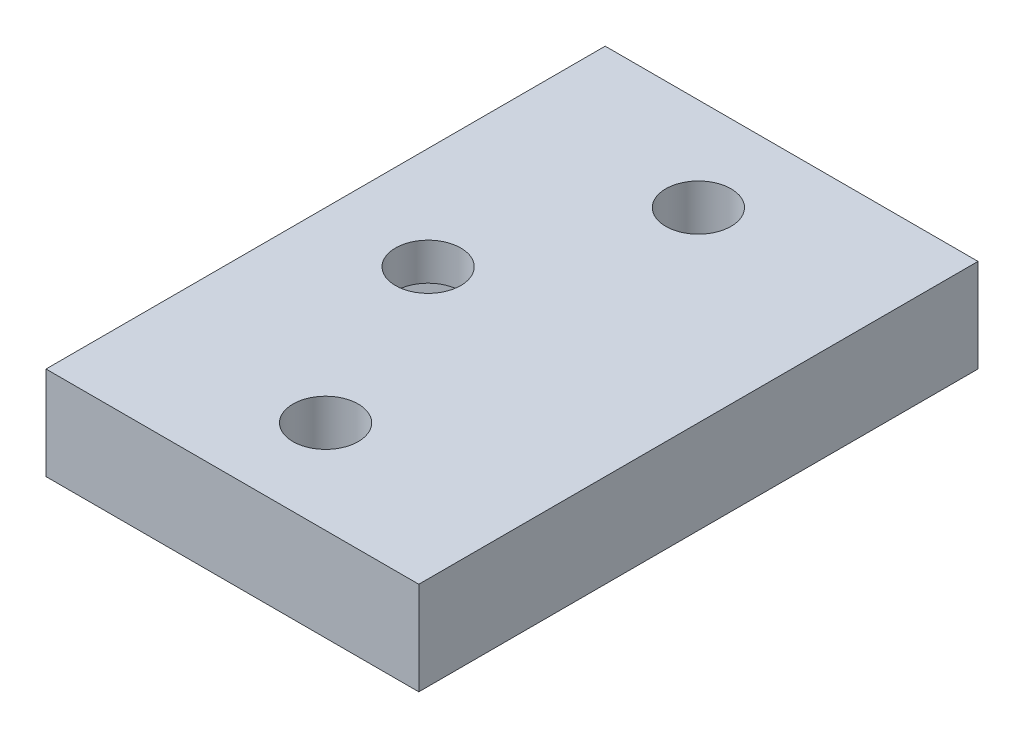
ISO-10303-21;
HEADER;
FILE_DESCRIPTION(('STEP AP214'),'2;1');
FILE_NAME('part.step','',(''),(''),'','','');
FILE_SCHEMA(('AUTOMOTIVE_DESIGN { 1 0 10303 214 1 1 1 1 }'));
ENDSEC;
DATA;
#1=APPLICATION_CONTEXT('core data for automotive mechanical design processes');
#2=APPLICATION_PROTOCOL_DEFINITION('international standard','automotive_design',2000,#1);
#3=PRODUCT_CONTEXT('',#1,'mechanical');
#4=PRODUCT('Part','Part','',(#3));
#5=PRODUCT_RELATED_PRODUCT_CATEGORY('part','',(#4));
#6=PRODUCT_DEFINITION_FORMATION('','',#4);
#7=PRODUCT_DEFINITION_CONTEXT('part definition',#1,'design');
#8=PRODUCT_DEFINITION('design','',#6,#7);
#9=PRODUCT_DEFINITION_SHAPE('','',#8);
#10=(LENGTH_UNIT() NAMED_UNIT(*) SI_UNIT(.MILLI.,.METRE.));
#11=(NAMED_UNIT(*) PLANE_ANGLE_UNIT() SI_UNIT($,.RADIAN.));
#12=(NAMED_UNIT(*) SI_UNIT($,.STERADIAN.) SOLID_ANGLE_UNIT());
#13=UNCERTAINTY_MEASURE_WITH_UNIT(LENGTH_MEASURE(1.E-05),#10,'distance_accuracy_value','');
#14=(GEOMETRIC_REPRESENTATION_CONTEXT(3) GLOBAL_UNCERTAINTY_ASSIGNED_CONTEXT((#13)) GLOBAL_UNIT_ASSIGNED_CONTEXT((#10,
#11,#12)) REPRESENTATION_CONTEXT('',''));
#15=CARTESIAN_POINT('',(0.,0.,0.));
#16=DIRECTION('',(0.,0.,1.));
#17=DIRECTION('',(1.,0.,0.));
#18=AXIS2_PLACEMENT_3D('',#15,#16,#17);
#19=CARTESIAN_POINT('',(0.,5.,0.));
#20=DIRECTION('',(1.,0.,0.));
#21=DIRECTION('',(0.,0.,-1.));
#22=AXIS2_PLACEMENT_3D('',#19,#20,#21);
#23=PLANE('',#22);
#24=DIRECTION('',(0.,0.,1.));
#25=VECTOR('',#24,1.);
#26=CARTESIAN_POINT('',(0.,0.,0.));
#27=LINE('',#26,#25);
#28=CARTESIAN_POINT('',(0.,0.,-30.));
#29=VERTEX_POINT('',#28);
#30=CARTESIAN_POINT('',(0.,0.,-18.));
#31=VERTEX_POINT('',#30);
#32=EDGE_CURVE('E157',#29,#31,#27,.T.);
#33=ORIENTED_EDGE('',*,*,#32,.T.);
#34=DIRECTION('',(0.,-1.,0.));
#35=VECTOR('',#34,1.);
#36=CARTESIAN_POINT('',(0.,0.,-18.));
#37=LINE('',#36,#35);
#38=CARTESIAN_POINT('',(0.,3.,-18.));
#39=VERTEX_POINT('',#38);
#40=EDGE_CURVE('E178',#39,#31,#37,.T.);
#41=ORIENTED_EDGE('',*,*,#40,.F.);
#42=DIRECTION('',(0.,0.,-1.));
#43=VECTOR('',#42,1.);
#44=CARTESIAN_POINT('',(0.,3.,-18.));
#45=LINE('',#44,#43);
#46=CARTESIAN_POINT('',(0.,3.,-12.));
#47=VERTEX_POINT('',#46);
#48=EDGE_CURVE('E202',#47,#39,#45,.T.);
#49=ORIENTED_EDGE('',*,*,#48,.F.);
#50=DIRECTION('',(0.,1.,0.));
#51=VECTOR('',#50,1.);
#52=CARTESIAN_POINT('',(0.,0.,-12.));
#53=LINE('',#52,#51);
#54=CARTESIAN_POINT('',(0.,0.,-12.));
#55=VERTEX_POINT('',#54);
#56=EDGE_CURVE('E200',#55,#47,#53,.T.);
#57=ORIENTED_EDGE('',*,*,#56,.F.);
#58=CARTESIAN_POINT('',(0.,0.,0.));
#59=VERTEX_POINT('',#58);
#60=EDGE_CURVE('E127',#55,#59,#27,.T.);
#61=ORIENTED_EDGE('',*,*,#60,.T.);
#62=DIRECTION('',(0.,-1.,0.));
#63=VECTOR('',#62,1.);
#64=CARTESIAN_POINT('',(0.,5.,0.));
#65=LINE('',#64,#63);
#66=CARTESIAN_POINT('',(0.,5.,0.));
#67=VERTEX_POINT('',#66);
#68=EDGE_CURVE('E11',#67,#59,#65,.T.);
#69=ORIENTED_EDGE('',*,*,#68,.F.);
#70=DIRECTION('',(0.,0.,1.));
#71=VECTOR('',#70,1.);
#72=CARTESIAN_POINT('',(0.,5.,0.));
#73=LINE('',#72,#71);
#74=CARTESIAN_POINT('',(0.,5.,-30.));
#75=VERTEX_POINT('',#74);
#76=EDGE_CURVE('E150',#75,#67,#73,.T.);
#77=ORIENTED_EDGE('',*,*,#76,.F.);
#78=DIRECTION('',(0.,-1.,0.));
#79=VECTOR('',#78,1.);
#80=CARTESIAN_POINT('',(0.,5.,-30.));
#81=LINE('',#80,#79);
#82=EDGE_CURVE('E156',#75,#29,#81,.T.);
#83=ORIENTED_EDGE('',*,*,#82,.T.);
#84=EDGE_LOOP('',(#33,#41,#49,#57,#61,#69,#77,#83));
#85=FACE_BOUND('',#84,.T.);
#86=ADVANCED_FACE('F32',(#85),#23,.F.);
#87=CARTESIAN_POINT('',(0.,5.,0.));
#88=DIRECTION('',(0.,0.,-1.));
#89=DIRECTION('',(-1.,0.,0.));
#90=AXIS2_PLACEMENT_3D('',#87,#88,#89);
#91=PLANE('',#90);
#92=DIRECTION('',(1.,0.,0.));
#93=VECTOR('',#92,1.);
#94=CARTESIAN_POINT('',(0.,0.,0.));
#95=LINE('',#94,#93);
#96=CARTESIAN_POINT('',(20.,0.,0.));
#97=VERTEX_POINT('',#96);
#98=EDGE_CURVE('E160',#59,#97,#95,.T.);
#99=ORIENTED_EDGE('',*,*,#98,.T.);
#100=DIRECTION('',(0.,-1.,0.));
#101=VECTOR('',#100,1.);
#102=CARTESIAN_POINT('',(20.,5.,0.));
#103=LINE('',#102,#101);
#104=CARTESIAN_POINT('',(20.,5.,0.));
#105=VERTEX_POINT('',#104);
#106=EDGE_CURVE('E40',#105,#97,#103,.T.);
#107=ORIENTED_EDGE('',*,*,#106,.F.);
#108=DIRECTION('',(1.,0.,0.));
#109=VECTOR('',#108,1.);
#110=CARTESIAN_POINT('',(0.,5.,0.));
#111=LINE('',#110,#109);
#112=EDGE_CURVE('E84',#67,#105,#111,.T.);
#113=ORIENTED_EDGE('',*,*,#112,.F.);
#114=ORIENTED_EDGE('',*,*,#68,.T.);
#115=EDGE_LOOP('',(#99,#107,#113,#114));
#116=FACE_BOUND('',#115,.T.);
#117=ADVANCED_FACE('F191',(#116),#91,.F.);
#118=CARTESIAN_POINT('',(20.,5.,0.));
#119=DIRECTION('',(-1.,0.,0.));
#120=DIRECTION('',(0.,0.,1.));
#121=AXIS2_PLACEMENT_3D('',#118,#119,#120);
#122=PLANE('',#121);
#123=DIRECTION('',(0.,0.,-1.));
#124=VECTOR('',#123,1.);
#125=CARTESIAN_POINT('',(20.,0.,0.));
#126=LINE('',#125,#124);
#127=CARTESIAN_POINT('',(20.,0.,-30.));
#128=VERTEX_POINT('',#127);
#129=EDGE_CURVE('E162',#97,#128,#126,.T.);
#130=ORIENTED_EDGE('',*,*,#129,.T.);
#131=DIRECTION('',(0.,-1.,0.));
#132=VECTOR('',#131,1.);
#133=CARTESIAN_POINT('',(20.,5.,-30.));
#134=LINE('',#133,#132);
#135=CARTESIAN_POINT('',(20.,5.,-30.));
#136=VERTEX_POINT('',#135);
#137=EDGE_CURVE('E166',#136,#128,#134,.T.);
#138=ORIENTED_EDGE('',*,*,#137,.F.);
#139=DIRECTION('',(0.,0.,-1.));
#140=VECTOR('',#139,1.);
#141=CARTESIAN_POINT('',(20.,5.,0.));
#142=LINE('',#141,#140);
#143=EDGE_CURVE('E153',#105,#136,#142,.T.);
#144=ORIENTED_EDGE('',*,*,#143,.F.);
#145=ORIENTED_EDGE('',*,*,#106,.T.);
#146=EDGE_LOOP('',(#130,#138,#144,#145));
#147=FACE_BOUND('',#146,.T.);
#148=ADVANCED_FACE('F172',(#147),#122,.F.);
#149=CARTESIAN_POINT('',(0.,5.,-30.));
#150=DIRECTION('',(0.,0.,1.));
#151=DIRECTION('',(1.,0.,0.));
#152=AXIS2_PLACEMENT_3D('',#149,#150,#151);
#153=PLANE('',#152);
#154=DIRECTION('',(-1.,0.,0.));
#155=VECTOR('',#154,1.);
#156=CARTESIAN_POINT('',(0.,0.,-30.));
#157=LINE('',#156,#155);
#158=EDGE_CURVE('E77',#128,#29,#157,.T.);
#159=ORIENTED_EDGE('',*,*,#158,.T.);
#160=ORIENTED_EDGE('',*,*,#82,.F.);
#161=DIRECTION('',(-1.,0.,0.));
#162=VECTOR('',#161,1.);
#163=CARTESIAN_POINT('',(0.,5.,-30.));
#164=LINE('',#163,#162);
#165=EDGE_CURVE('E56',#136,#75,#164,.T.);
#166=ORIENTED_EDGE('',*,*,#165,.F.);
#167=ORIENTED_EDGE('',*,*,#137,.T.);
#168=EDGE_LOOP('',(#159,#160,#166,#167));
#169=FACE_BOUND('',#168,.T.);
#170=ADVANCED_FACE('F181',(#169),#153,.F.);
#171=CARTESIAN_POINT('',(0.,5.,0.));
#172=DIRECTION('',(0.,-1.,0.));
#173=DIRECTION('',(0.,0.,-1.));
#174=AXIS2_PLACEMENT_3D('',#171,#172,#173);
#175=PLANE('',#174);
#176=CARTESIAN_POINT('',(10.,5.,-25.));
#177=DIRECTION('',(0.,1.,0.));
#178=DIRECTION('',(0.,0.,1.));
#179=AXIS2_PLACEMENT_3D('',#176,#177,#178);
#180=CIRCLE('',#179,1.75);
#181=CARTESIAN_POINT('',(10.,5.,-23.25));
#182=VERTEX_POINT('',#181);
#183=EDGE_CURVE('E139',#182,#182,#180,.T.);
#184=ORIENTED_EDGE('',*,*,#183,.F.);
#185=EDGE_LOOP('',(#184));
#186=FACE_BOUND('',#185,.T.);
#187=CARTESIAN_POINT('',(10.,5.,-5.));
#188=DIRECTION('',(0.,1.,0.));
#189=DIRECTION('',(0.,0.,1.));
#190=AXIS2_PLACEMENT_3D('',#187,#188,#189);
#191=CIRCLE('',#190,1.75);
#192=CARTESIAN_POINT('',(10.,5.,-3.25));
#193=VERTEX_POINT('',#192);
#194=EDGE_CURVE('E145',#193,#193,#191,.T.);
#195=ORIENTED_EDGE('',*,*,#194,.F.);
#196=EDGE_LOOP('',(#195));
#197=FACE_BOUND('',#196,.T.);
#198=CARTESIAN_POINT('',(5.5,5.,-15.));
#199=DIRECTION('',(0.,1.,0.));
#200=DIRECTION('',(0.,0.,1.));
#201=AXIS2_PLACEMENT_3D('',#198,#199,#200);
#202=CIRCLE('',#201,1.75);
#203=CARTESIAN_POINT('',(5.5,5.,-13.25));
#204=VERTEX_POINT('',#203);
#205=EDGE_CURVE('E138',#204,#204,#202,.T.);
#206=ORIENTED_EDGE('',*,*,#205,.F.);
#207=EDGE_LOOP('',(#206));
#208=FACE_BOUND('',#207,.T.);
#209=ORIENTED_EDGE('',*,*,#76,.T.);
#210=ORIENTED_EDGE('',*,*,#112,.T.);
#211=ORIENTED_EDGE('',*,*,#143,.T.);
#212=ORIENTED_EDGE('',*,*,#165,.T.);
#213=EDGE_LOOP('',(#209,#210,#211,#212));
#214=FACE_BOUND('',#213,.T.);
#215=ADVANCED_FACE('F183',(#186,#197,#208,#214),#175,.F.);
#216=CARTESIAN_POINT('',(0.,0.,0.));
#217=DIRECTION('',(0.,-1.,0.));
#218=DIRECTION('',(0.,0.,-1.));
#219=AXIS2_PLACEMENT_3D('',#216,#217,#218);
#220=PLANE('',#219);
#221=DIRECTION('',(-1.,0.,0.));
#222=VECTOR('',#221,1.);
#223=CARTESIAN_POINT('',(9.,0.,-18.));
#224=LINE('',#223,#222);
#225=CARTESIAN_POINT('',(9.,0.,-18.));
#226=VERTEX_POINT('',#225);
#227=EDGE_CURVE('E128',#226,#31,#224,.T.);
#228=ORIENTED_EDGE('',*,*,#227,.T.);
#229=ORIENTED_EDGE('',*,*,#32,.F.);
#230=ORIENTED_EDGE('',*,*,#158,.F.);
#231=ORIENTED_EDGE('',*,*,#129,.F.);
#232=ORIENTED_EDGE('',*,*,#98,.F.);
#233=ORIENTED_EDGE('',*,*,#60,.F.);
#234=DIRECTION('',(-1.,0.,0.));
#235=VECTOR('',#234,1.);
#236=CARTESIAN_POINT('',(9.,0.,-12.));
#237=LINE('',#236,#235);
#238=CARTESIAN_POINT('',(9.,0.,-12.));
#239=VERTEX_POINT('',#238);
#240=EDGE_CURVE('E111',#239,#55,#237,.T.);
#241=ORIENTED_EDGE('',*,*,#240,.F.);
#242=DIRECTION('',(0.,0.,1.));
#243=VECTOR('',#242,1.);
#244=CARTESIAN_POINT('',(9.,0.,-18.));
#245=LINE('',#244,#243);
#246=EDGE_CURVE('E116',#226,#239,#245,.T.);
#247=ORIENTED_EDGE('',*,*,#246,.F.);
#248=EDGE_LOOP('',(#228,#229,#230,#231,#232,#233,#241,#247));
#249=FACE_BOUND('',#248,.T.);
#250=CARTESIAN_POINT('',(10.,0.,-25.));
#251=DIRECTION('',(0.,1.,0.));
#252=DIRECTION('',(0.,0.,1.));
#253=AXIS2_PLACEMENT_3D('',#250,#251,#252);
#254=CIRCLE('',#253,1.75);
#255=CARTESIAN_POINT('',(10.,0.,-23.25));
#256=VERTEX_POINT('',#255);
#257=EDGE_CURVE('E135',#256,#256,#254,.T.);
#258=ORIENTED_EDGE('',*,*,#257,.T.);
#259=EDGE_LOOP('',(#258));
#260=FACE_BOUND('',#259,.T.);
#261=CARTESIAN_POINT('',(10.,0.,-5.));
#262=DIRECTION('',(0.,1.,0.));
#263=DIRECTION('',(0.,0.,1.));
#264=AXIS2_PLACEMENT_3D('',#261,#262,#263);
#265=CIRCLE('',#264,1.75);
#266=CARTESIAN_POINT('',(10.,0.,-3.25));
#267=VERTEX_POINT('',#266);
#268=EDGE_CURVE('E142',#267,#267,#265,.T.);
#269=ORIENTED_EDGE('',*,*,#268,.T.);
#270=EDGE_LOOP('',(#269));
#271=FACE_BOUND('',#270,.T.);
#272=ADVANCED_FACE('F124',(#249,#260,#271),#220,.T.);
#273=CARTESIAN_POINT('',(5.5,-3.,-15.));
#274=DIRECTION('',(0.,1.,0.));
#275=DIRECTION('',(0.,0.,1.));
#276=AXIS2_PLACEMENT_3D('',#273,#274,#275);
#277=CYLINDRICAL_SURFACE('',#276,1.75);
#278=CARTESIAN_POINT('',(5.5,3.,-15.));
#279=DIRECTION('',(0.,1.,0.));
#280=DIRECTION('',(0.,0.,1.));
#281=AXIS2_PLACEMENT_3D('',#278,#279,#280);
#282=CIRCLE('',#281,1.75);
#283=CARTESIAN_POINT('',(5.5,3.,-13.25));
#284=VERTEX_POINT('',#283);
#285=EDGE_CURVE('E35',#284,#284,#282,.F.);
#286=ORIENTED_EDGE('',*,*,#285,.T.);
#287=EDGE_LOOP('',(#286));
#288=FACE_BOUND('',#287,.T.);
#289=ORIENTED_EDGE('',*,*,#205,.T.);
#290=EDGE_LOOP('',(#289));
#291=FACE_BOUND('',#290,.T.);
#292=ADVANCED_FACE('F211',(#288,#291),#277,.F.);
#293=CARTESIAN_POINT('',(10.,0.,-5.));
#294=DIRECTION('',(0.,1.,0.));
#295=DIRECTION('',(0.,0.,1.));
#296=AXIS2_PLACEMENT_3D('',#293,#294,#295);
#297=CYLINDRICAL_SURFACE('',#296,1.75);
#298=ORIENTED_EDGE('',*,*,#268,.F.);
#299=EDGE_LOOP('',(#298));
#300=FACE_BOUND('',#299,.T.);
#301=ORIENTED_EDGE('',*,*,#194,.T.);
#302=EDGE_LOOP('',(#301));
#303=FACE_BOUND('',#302,.T.);
#304=ADVANCED_FACE('F225',(#300,#303),#297,.F.);
#305=CARTESIAN_POINT('',(10.,0.,-25.));
#306=DIRECTION('',(0.,1.,0.));
#307=DIRECTION('',(0.,0.,1.));
#308=AXIS2_PLACEMENT_3D('',#305,#306,#307);
#309=CYLINDRICAL_SURFACE('',#308,1.75);
#310=ORIENTED_EDGE('',*,*,#257,.F.);
#311=EDGE_LOOP('',(#310));
#312=FACE_BOUND('',#311,.T.);
#313=ORIENTED_EDGE('',*,*,#183,.T.);
#314=EDGE_LOOP('',(#313));
#315=FACE_BOUND('',#314,.T.);
#316=ADVANCED_FACE('F217',(#312,#315),#309,.F.);
#317=CARTESIAN_POINT('',(9.,3.,-18.));
#318=DIRECTION('',(0.,1.,0.));
#319=DIRECTION('',(0.,0.,1.));
#320=AXIS2_PLACEMENT_3D('',#317,#318,#319);
#321=PLANE('',#320);
#322=ORIENTED_EDGE('',*,*,#48,.T.);
#323=DIRECTION('',(-1.,0.,0.));
#324=VECTOR('',#323,1.);
#325=CARTESIAN_POINT('',(9.,3.,-18.));
#326=LINE('',#325,#324);
#327=CARTESIAN_POINT('',(9.,3.,-18.));
#328=VERTEX_POINT('',#327);
#329=EDGE_CURVE('E130',#328,#39,#326,.T.);
#330=ORIENTED_EDGE('',*,*,#329,.F.);
#331=DIRECTION('',(0.,0.,-1.));
#332=VECTOR('',#331,1.);
#333=CARTESIAN_POINT('',(9.,3.,-18.));
#334=LINE('',#333,#332);
#335=CARTESIAN_POINT('',(9.,3.,-12.));
#336=VERTEX_POINT('',#335);
#337=EDGE_CURVE('E115',#336,#328,#334,.T.);
#338=ORIENTED_EDGE('',*,*,#337,.F.);
#339=DIRECTION('',(-1.,0.,0.));
#340=VECTOR('',#339,1.);
#341=CARTESIAN_POINT('',(9.,3.,-12.));
#342=LINE('',#341,#340);
#343=EDGE_CURVE('E113',#336,#47,#342,.T.);
#344=ORIENTED_EDGE('',*,*,#343,.T.);
#345=EDGE_LOOP('',(#322,#330,#338,#344));
#346=FACE_BOUND('',#345,.T.);
#347=ORIENTED_EDGE('',*,*,#285,.F.);
#348=EDGE_LOOP('',(#347));
#349=FACE_BOUND('',#348,.T.);
#350=ADVANCED_FACE('F214',(#346,#349),#321,.F.);
#351=CARTESIAN_POINT('',(9.,0.,-18.));
#352=DIRECTION('',(0.,0.,-1.));
#353=DIRECTION('',(-1.,0.,0.));
#354=AXIS2_PLACEMENT_3D('',#351,#352,#353);
#355=PLANE('',#354);
#356=ORIENTED_EDGE('',*,*,#40,.T.);
#357=ORIENTED_EDGE('',*,*,#227,.F.);
#358=DIRECTION('',(0.,-1.,0.));
#359=VECTOR('',#358,1.);
#360=CARTESIAN_POINT('',(9.,0.,-18.));
#361=LINE('',#360,#359);
#362=EDGE_CURVE('E47',#328,#226,#361,.T.);
#363=ORIENTED_EDGE('',*,*,#362,.F.);
#364=ORIENTED_EDGE('',*,*,#329,.T.);
#365=EDGE_LOOP('',(#356,#357,#363,#364));
#366=FACE_BOUND('',#365,.T.);
#367=ADVANCED_FACE('F216',(#366),#355,.F.);
#368=CARTESIAN_POINT('',(9.,0.,-12.));
#369=DIRECTION('',(0.,0.,1.));
#370=DIRECTION('',(1.,0.,0.));
#371=AXIS2_PLACEMENT_3D('',#368,#369,#370);
#372=PLANE('',#371);
#373=ORIENTED_EDGE('',*,*,#56,.T.);
#374=ORIENTED_EDGE('',*,*,#343,.F.);
#375=DIRECTION('',(0.,1.,0.));
#376=VECTOR('',#375,1.);
#377=CARTESIAN_POINT('',(9.,0.,-12.));
#378=LINE('',#377,#376);
#379=EDGE_CURVE('E107',#239,#336,#378,.T.);
#380=ORIENTED_EDGE('',*,*,#379,.F.);
#381=ORIENTED_EDGE('',*,*,#240,.T.);
#382=EDGE_LOOP('',(#373,#374,#380,#381));
#383=FACE_BOUND('',#382,.T.);
#384=ADVANCED_FACE('F109',(#383),#372,.F.);
#385=CARTESIAN_POINT('',(9.,0.,0.));
#386=DIRECTION('',(1.,0.,0.));
#387=DIRECTION('',(0.,0.,-1.));
#388=AXIS2_PLACEMENT_3D('',#385,#386,#387);
#389=PLANE('',#388);
#390=ORIENTED_EDGE('',*,*,#362,.T.);
#391=ORIENTED_EDGE('',*,*,#246,.T.);
#392=ORIENTED_EDGE('',*,*,#379,.T.);
#393=ORIENTED_EDGE('',*,*,#337,.T.);
#394=EDGE_LOOP('',(#390,#391,#392,#393));
#395=FACE_BOUND('',#394,.T.);
#396=ADVANCED_FACE('F119',(#395),#389,.F.);
#397=CLOSED_SHELL('',(#86,#117,#148,#170,#215,#272,#292,#304,#316,#350,#367,#384,#396));
#398=MANIFOLD_SOLID_BREP('B2',#397);
#399=ADVANCED_BREP_SHAPE_REPRESENTATION('',(#18,#398),#14);
#400=SHAPE_DEFINITION_REPRESENTATION(#9,#399);
ENDSEC;
END-ISO-10303-21;
